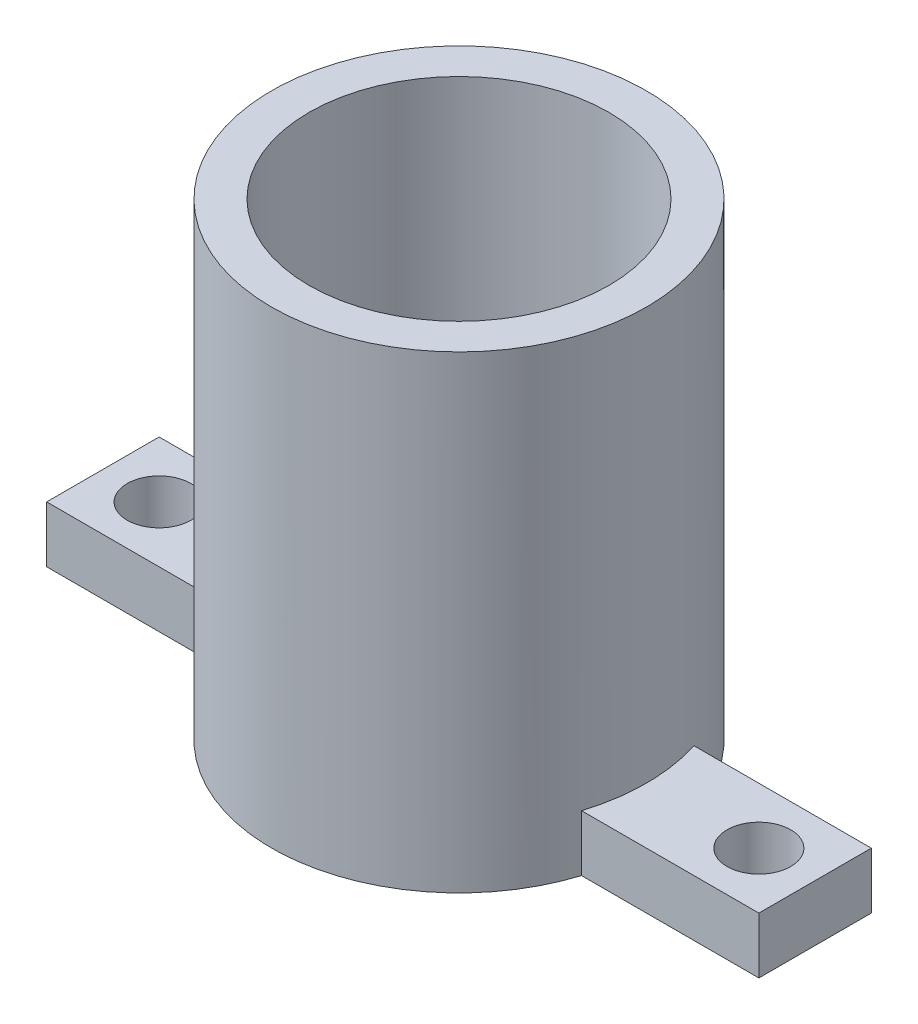
ISO-10303-21;
HEADER;
FILE_DESCRIPTION(('STEP AP214'),'2;1');
FILE_NAME('part.step','',(''),(''),'','','');
FILE_SCHEMA(('AUTOMOTIVE_DESIGN { 1 0 10303 214 1 1 1 1 }'));
ENDSEC;
DATA;
#1=APPLICATION_CONTEXT('core data for automotive mechanical design processes');
#2=APPLICATION_PROTOCOL_DEFINITION('international standard','automotive_design',2000,#1);
#3=PRODUCT_CONTEXT('',#1,'mechanical');
#4=PRODUCT('Part','Part','',(#3));
#5=PRODUCT_RELATED_PRODUCT_CATEGORY('part','',(#4));
#6=PRODUCT_DEFINITION_FORMATION('','',#4);
#7=PRODUCT_DEFINITION_CONTEXT('part definition',#1,'design');
#8=PRODUCT_DEFINITION('design','',#6,#7);
#9=PRODUCT_DEFINITION_SHAPE('','',#8);
#10=(LENGTH_UNIT() NAMED_UNIT(*) SI_UNIT(.MILLI.,.METRE.));
#11=(NAMED_UNIT(*) PLANE_ANGLE_UNIT() SI_UNIT($,.RADIAN.));
#12=(NAMED_UNIT(*) SI_UNIT($,.STERADIAN.) SOLID_ANGLE_UNIT());
#13=UNCERTAINTY_MEASURE_WITH_UNIT(LENGTH_MEASURE(1.E-05),#10,'distance_accuracy_value','');
#14=(GEOMETRIC_REPRESENTATION_CONTEXT(3) GLOBAL_UNCERTAINTY_ASSIGNED_CONTEXT((#13)) GLOBAL_UNIT_ASSIGNED_CONTEXT((#10,
#11,#12)) REPRESENTATION_CONTEXT('',''));
#15=CARTESIAN_POINT('',(0.,0.,0.));
#16=DIRECTION('',(0.,0.,1.));
#17=DIRECTION('',(1.,0.,0.));
#18=AXIS2_PLACEMENT_3D('',#15,#16,#17);
#19=CARTESIAN_POINT('',(0.,3.,0.));
#20=DIRECTION('',(0.,0.,-1.));
#21=DIRECTION('',(-1.,0.,0.));
#22=AXIS2_PLACEMENT_3D('',#19,#20,#21);
#23=PLANE('',#22);
#24=DIRECTION('',(1.,0.,0.));
#25=VECTOR('',#24,1.);
#26=CARTESIAN_POINT('',(0.,0.,0.));
#27=LINE('',#26,#25);
#28=CARTESIAN_POINT('',(28.5393920141695,0.,0.));
#29=VERTEX_POINT('',#28);
#30=CARTESIAN_POINT('',(38.,0.,0.));
#31=VERTEX_POINT('',#30);
#32=EDGE_CURVE('E164',#29,#31,#27,.T.);
#33=ORIENTED_EDGE('',*,*,#32,.T.);
#34=DIRECTION('',(0.,-1.,0.));
#35=VECTOR('',#34,1.);
#36=CARTESIAN_POINT('',(38.,3.,0.));
#37=LINE('',#36,#35);
#38=CARTESIAN_POINT('',(38.,3.,0.));
#39=VERTEX_POINT('',#38);
#40=EDGE_CURVE('E53',#39,#31,#37,.T.);
#41=ORIENTED_EDGE('',*,*,#40,.F.);
#42=DIRECTION('',(1.,0.,0.));
#43=VECTOR('',#42,1.);
#44=CARTESIAN_POINT('',(0.,3.,0.));
#45=LINE('',#44,#43);
#46=CARTESIAN_POINT('',(28.5393920141695,3.,0.));
#47=VERTEX_POINT('',#46);
#48=EDGE_CURVE('E174',#47,#39,#45,.T.);
#49=ORIENTED_EDGE('',*,*,#48,.F.);
#50=DIRECTION('',(0.,-1.,0.));
#51=VECTOR('',#50,1.);
#52=CARTESIAN_POINT('',(28.5393920141695,3.,0.));
#53=LINE('',#52,#51);
#54=EDGE_CURVE('E11',#47,#29,#53,.T.);
#55=ORIENTED_EDGE('',*,*,#54,.T.);
#56=EDGE_LOOP('',(#33,#41,#49,#55));
#57=FACE_BOUND('',#56,.T.);
#58=ADVANCED_FACE('F45',(#57),#23,.F.);
#59=CARTESIAN_POINT('',(38.,3.,0.));
#60=DIRECTION('',(-1.,0.,0.));
#61=DIRECTION('',(0.,0.,1.));
#62=AXIS2_PLACEMENT_3D('',#59,#60,#61);
#63=PLANE('',#62);
#64=DIRECTION('',(0.,0.,-1.));
#65=VECTOR('',#64,1.);
#66=CARTESIAN_POINT('',(38.,0.,0.));
#67=LINE('',#66,#65);
#68=CARTESIAN_POINT('',(38.,0.,-6.));
#69=VERTEX_POINT('',#68);
#70=EDGE_CURVE('E188',#31,#69,#67,.T.);
#71=ORIENTED_EDGE('',*,*,#70,.T.);
#72=DIRECTION('',(0.,-1.,0.));
#73=VECTOR('',#72,1.);
#74=CARTESIAN_POINT('',(38.,3.,-6.));
#75=LINE('',#74,#73);
#76=CARTESIAN_POINT('',(38.,3.,-6.));
#77=VERTEX_POINT('',#76);
#78=EDGE_CURVE('E198',#77,#69,#75,.T.);
#79=ORIENTED_EDGE('',*,*,#78,.F.);
#80=DIRECTION('',(0.,0.,-1.));
#81=VECTOR('',#80,1.);
#82=CARTESIAN_POINT('',(38.,3.,0.));
#83=LINE('',#82,#81);
#84=EDGE_CURVE('E178',#39,#77,#83,.T.);
#85=ORIENTED_EDGE('',*,*,#84,.F.);
#86=ORIENTED_EDGE('',*,*,#40,.T.);
#87=EDGE_LOOP('',(#71,#79,#85,#86));
#88=FACE_BOUND('',#87,.T.);
#89=ADVANCED_FACE('F206',(#88),#63,.F.);
#90=CARTESIAN_POINT('',(0.,3.,-6.));
#91=DIRECTION('',(0.,0.,-1.));
#92=DIRECTION('',(-1.,0.,0.));
#93=AXIS2_PLACEMENT_3D('',#90,#91,#92);
#94=PLANE('',#93);
#95=DIRECTION('',(1.,0.,0.));
#96=VECTOR('',#95,1.);
#97=CARTESIAN_POINT('',(0.,0.,-6.));
#98=LINE('',#97,#96);
#99=CARTESIAN_POINT('',(28.5393920141695,0.,-6.));
#100=VERTEX_POINT('',#99);
#101=EDGE_CURVE('E175',#100,#69,#98,.T.);
#102=ORIENTED_EDGE('',*,*,#101,.F.);
#103=DIRECTION('',(0.,-1.,0.));
#104=VECTOR('',#103,1.);
#105=CARTESIAN_POINT('',(28.5393920141695,3.,-6.));
#106=LINE('',#105,#104);
#107=CARTESIAN_POINT('',(28.5393920141695,3.,-6.));
#108=VERTEX_POINT('',#107);
#109=EDGE_CURVE('E185',#108,#100,#106,.T.);
#110=ORIENTED_EDGE('',*,*,#109,.F.);
#111=DIRECTION('',(1.,0.,0.));
#112=VECTOR('',#111,1.);
#113=CARTESIAN_POINT('',(0.,3.,-6.));
#114=LINE('',#113,#112);
#115=EDGE_CURVE('E181',#108,#77,#114,.T.);
#116=ORIENTED_EDGE('',*,*,#115,.T.);
#117=ORIENTED_EDGE('',*,*,#78,.T.);
#118=EDGE_LOOP('',(#102,#110,#116,#117));
#119=FACE_BOUND('',#118,.T.);
#120=ADVANCED_FACE('F217',(#119),#94,.T.);
#121=CARTESIAN_POINT('',(0.,3.,0.));
#122=DIRECTION('',(0.,1.,0.));
#123=DIRECTION('',(0.,0.,1.));
#124=AXIS2_PLACEMENT_3D('',#121,#122,#123);
#125=PLANE('',#124);
#126=CARTESIAN_POINT('',(35.,3.,-3.));
#127=DIRECTION('',(0.,1.,0.));
#128=DIRECTION('',(0.,0.,1.));
#129=AXIS2_PLACEMENT_3D('',#126,#127,#128);
#130=CIRCLE('',#129,1.69999999999999);
#131=CARTESIAN_POINT('',(35.,3.,-1.30000000000001));
#132=VERTEX_POINT('',#131);
#133=EDGE_CURVE('E333',#132,#132,#130,.T.);
#134=ORIENTED_EDGE('',*,*,#133,.F.);
#135=EDGE_LOOP('',(#134));
#136=FACE_BOUND('',#135,.T.);
#137=CARTESIAN_POINT('',(19.,3.,-3.));
#138=DIRECTION('',(0.,1.,0.));
#139=DIRECTION('',(0.,0.,1.));
#140=AXIS2_PLACEMENT_3D('',#137,#138,#139);
#141=CIRCLE('',#140,10.);
#142=EDGE_CURVE('E171',#47,#108,#141,.T.);
#143=ORIENTED_EDGE('',*,*,#142,.F.);
#144=ORIENTED_EDGE('',*,*,#48,.T.);
#145=ORIENTED_EDGE('',*,*,#84,.T.);
#146=ORIENTED_EDGE('',*,*,#115,.F.);
#147=EDGE_LOOP('',(#143,#144,#145,#146));
#148=FACE_BOUND('',#147,.T.);
#149=ADVANCED_FACE('F221',(#136,#148),#125,.T.);
#150=CARTESIAN_POINT('',(0.,0.,0.));
#151=DIRECTION('',(0.,1.,0.));
#152=DIRECTION('',(0.,0.,1.));
#153=AXIS2_PLACEMENT_3D('',#150,#151,#152);
#154=PLANE('',#153);
#155=CARTESIAN_POINT('',(3.,0.,-3.));
#156=DIRECTION('',(0.,1.,0.));
#157=DIRECTION('',(0.,0.,1.));
#158=AXIS2_PLACEMENT_3D('',#155,#156,#157);
#159=CIRCLE('',#158,1.7);
#160=CARTESIAN_POINT('',(3.,0.,-1.3));
#161=VERTEX_POINT('',#160);
#162=EDGE_CURVE('E326',#161,#161,#159,.T.);
#163=ORIENTED_EDGE('',*,*,#162,.T.);
#164=EDGE_LOOP('',(#163));
#165=FACE_BOUND('',#164,.T.);
#166=CARTESIAN_POINT('',(35.,0.,-3.));
#167=DIRECTION('',(0.,1.,0.));
#168=DIRECTION('',(0.,0.,1.));
#169=AXIS2_PLACEMENT_3D('',#166,#167,#168);
#170=CIRCLE('',#169,1.7);
#171=CARTESIAN_POINT('',(35.,0.,-1.3));
#172=VERTEX_POINT('',#171);
#173=EDGE_CURVE('E141',#172,#172,#170,.T.);
#174=ORIENTED_EDGE('',*,*,#173,.T.);
#175=EDGE_LOOP('',(#174));
#176=FACE_BOUND('',#175,.T.);
#177=ORIENTED_EDGE('',*,*,#32,.F.);
#178=CARTESIAN_POINT('',(19.,0.,-3.));
#179=DIRECTION('',(0.,1.,0.));
#180=DIRECTION('',(0.,0.,1.));
#181=AXIS2_PLACEMENT_3D('',#178,#179,#180);
#182=CIRCLE('',#181,10.);
#183=CARTESIAN_POINT('',(9.46060798583055,0.,0.));
#184=VERTEX_POINT('',#183);
#185=EDGE_CURVE('E168',#184,#29,#182,.T.);
#186=ORIENTED_EDGE('',*,*,#185,.F.);
#187=DIRECTION('',(1.,0.,0.));
#188=VECTOR('',#187,1.);
#189=CARTESIAN_POINT('',(0.,0.,0.));
#190=LINE('',#189,#188);
#191=CARTESIAN_POINT('',(0.,0.,0.));
#192=VERTEX_POINT('',#191);
#193=EDGE_CURVE('E144',#192,#184,#190,.T.);
#194=ORIENTED_EDGE('',*,*,#193,.F.);
#195=DIRECTION('',(0.,0.,-1.));
#196=VECTOR('',#195,1.);
#197=CARTESIAN_POINT('',(0.,0.,0.));
#198=LINE('',#197,#196);
#199=CARTESIAN_POINT('',(0.,0.,-6.));
#200=VERTEX_POINT('',#199);
#201=EDGE_CURVE('E140',#192,#200,#198,.T.);
#202=ORIENTED_EDGE('',*,*,#201,.T.);
#203=DIRECTION('',(1.,0.,0.));
#204=VECTOR('',#203,1.);
#205=CARTESIAN_POINT('',(0.,0.,-6.));
#206=LINE('',#205,#204);
#207=CARTESIAN_POINT('',(9.46060798583055,0.,-6.));
#208=VERTEX_POINT('',#207);
#209=EDGE_CURVE('E114',#200,#208,#206,.T.);
#210=ORIENTED_EDGE('',*,*,#209,.T.);
#211=EDGE_CURVE('E160',#100,#208,#182,.T.);
#212=ORIENTED_EDGE('',*,*,#211,.F.);
#213=ORIENTED_EDGE('',*,*,#101,.T.);
#214=ORIENTED_EDGE('',*,*,#70,.F.);
#215=EDGE_LOOP('',(#177,#186,#194,#202,#210,#212,#213,#214));
#216=FACE_BOUND('',#215,.T.);
#217=CARTESIAN_POINT('',(19.,0.,-3.));
#218=DIRECTION('',(0.,1.,0.));
#219=DIRECTION('',(0.,0.,1.));
#220=AXIS2_PLACEMENT_3D('',#217,#218,#219);
#221=CIRCLE('',#220,8.);
#222=CARTESIAN_POINT('',(19.,0.,5.));
#223=VERTEX_POINT('',#222);
#224=EDGE_CURVE('E154',#223,#223,#221,.T.);
#225=ORIENTED_EDGE('',*,*,#224,.T.);
#226=EDGE_LOOP('',(#225));
#227=FACE_BOUND('',#226,.T.);
#228=ADVANCED_FACE('F212',(#165,#176,#216,#227),#154,.F.);
#229=CARTESIAN_POINT('',(19.,25.,-3.));
#230=DIRECTION('',(0.,-1.,0.));
#231=DIRECTION('',(0.,0.,-1.));
#232=AXIS2_PLACEMENT_3D('',#229,#230,#231);
#233=CYLINDRICAL_SURFACE('',#232,10.);
#234=CARTESIAN_POINT('',(19.,25.,-3.));
#235=DIRECTION('',(0.,1.,0.));
#236=DIRECTION('',(0.,0.,1.));
#237=AXIS2_PLACEMENT_3D('',#234,#235,#236);
#238=CIRCLE('',#237,10.);
#239=CARTESIAN_POINT('',(19.,25.,7.));
#240=VERTEX_POINT('',#239);
#241=EDGE_CURVE('E159',#240,#240,#238,.T.);
#242=ORIENTED_EDGE('',*,*,#241,.F.);
#243=EDGE_LOOP('',(#242));
#244=FACE_BOUND('',#243,.T.);
#245=ORIENTED_EDGE('',*,*,#211,.T.);
#246=DIRECTION('',(0.,-1.,0.));
#247=VECTOR('',#246,1.);
#248=CARTESIAN_POINT('',(9.46060798583055,3.,-6.));
#249=LINE('',#248,#247);
#250=CARTESIAN_POINT('',(9.46060798583055,3.,-6.));
#251=VERTEX_POINT('',#250);
#252=EDGE_CURVE('E65',#251,#208,#249,.T.);
#253=ORIENTED_EDGE('',*,*,#252,.F.);
#254=CARTESIAN_POINT('',(19.,3.,-3.));
#255=DIRECTION('',(0.,1.,0.));
#256=DIRECTION('',(0.,0.,1.));
#257=AXIS2_PLACEMENT_3D('',#254,#255,#256);
#258=CIRCLE('',#257,10.);
#259=CARTESIAN_POINT('',(9.46060798583055,3.,0.));
#260=VERTEX_POINT('',#259);
#261=EDGE_CURVE('E60',#251,#260,#258,.T.);
#262=ORIENTED_EDGE('',*,*,#261,.T.);
#263=DIRECTION('',(0.,-1.,0.));
#264=VECTOR('',#263,1.);
#265=CARTESIAN_POINT('',(9.46060798583055,3.,0.));
#266=LINE('',#265,#264);
#267=EDGE_CURVE('E134',#260,#184,#266,.T.);
#268=ORIENTED_EDGE('',*,*,#267,.T.);
#269=ORIENTED_EDGE('',*,*,#185,.T.);
#270=ORIENTED_EDGE('',*,*,#54,.F.);
#271=ORIENTED_EDGE('',*,*,#142,.T.);
#272=ORIENTED_EDGE('',*,*,#109,.T.);
#273=EDGE_LOOP('',(#245,#253,#262,#268,#269,#270,#271,#272));
#274=FACE_BOUND('',#273,.T.);
#275=ADVANCED_FACE('F222',(#244,#274),#233,.T.);
#276=CARTESIAN_POINT('',(19.,25.,-3.));
#277=DIRECTION('',(0.,-1.,0.));
#278=DIRECTION('',(0.,0.,-1.));
#279=AXIS2_PLACEMENT_3D('',#276,#277,#278);
#280=CYLINDRICAL_SURFACE('',#279,8.);
#281=CARTESIAN_POINT('',(19.,25.,-3.));
#282=DIRECTION('',(0.,1.,0.));
#283=DIRECTION('',(0.,0.,1.));
#284=AXIS2_PLACEMENT_3D('',#281,#282,#283);
#285=CIRCLE('',#284,8.);
#286=CARTESIAN_POINT('',(19.,25.,5.));
#287=VERTEX_POINT('',#286);
#288=EDGE_CURVE('E155',#287,#287,#285,.T.);
#289=ORIENTED_EDGE('',*,*,#288,.T.);
#290=EDGE_LOOP('',(#289));
#291=FACE_BOUND('',#290,.T.);
#292=ORIENTED_EDGE('',*,*,#224,.F.);
#293=EDGE_LOOP('',(#292));
#294=FACE_BOUND('',#293,.T.);
#295=ADVANCED_FACE('F253',(#291,#294),#280,.F.);
#296=CARTESIAN_POINT('',(0.,25.,0.));
#297=DIRECTION('',(0.,1.,0.));
#298=DIRECTION('',(0.,0.,1.));
#299=AXIS2_PLACEMENT_3D('',#296,#297,#298);
#300=PLANE('',#299);
#301=ORIENTED_EDGE('',*,*,#288,.F.);
#302=EDGE_LOOP('',(#301));
#303=FACE_BOUND('',#302,.T.);
#304=ORIENTED_EDGE('',*,*,#241,.T.);
#305=EDGE_LOOP('',(#304));
#306=FACE_BOUND('',#305,.T.);
#307=ADVANCED_FACE('F256',(#303,#306),#300,.T.);
#308=CARTESIAN_POINT('',(0.,3.,-6.));
#309=DIRECTION('',(0.,0.,-1.));
#310=DIRECTION('',(-1.,0.,0.));
#311=AXIS2_PLACEMENT_3D('',#308,#309,#310);
#312=PLANE('',#311);
#313=ORIENTED_EDGE('',*,*,#209,.F.);
#314=DIRECTION('',(0.,-1.,0.));
#315=VECTOR('',#314,1.);
#316=CARTESIAN_POINT('',(0.,3.,-6.));
#317=LINE('',#316,#315);
#318=CARTESIAN_POINT('',(0.,3.,-6.));
#319=VERTEX_POINT('',#318);
#320=EDGE_CURVE('E109',#319,#200,#317,.T.);
#321=ORIENTED_EDGE('',*,*,#320,.F.);
#322=DIRECTION('',(1.,0.,0.));
#323=VECTOR('',#322,1.);
#324=CARTESIAN_POINT('',(0.,3.,-6.));
#325=LINE('',#324,#323);
#326=EDGE_CURVE('E112',#319,#251,#325,.T.);
#327=ORIENTED_EDGE('',*,*,#326,.T.);
#328=ORIENTED_EDGE('',*,*,#252,.T.);
#329=EDGE_LOOP('',(#313,#321,#327,#328));
#330=FACE_BOUND('',#329,.T.);
#331=ADVANCED_FACE('F111',(#330),#312,.T.);
#332=CARTESIAN_POINT('',(0.,3.,0.));
#333=DIRECTION('',(-1.,0.,0.));
#334=DIRECTION('',(0.,0.,1.));
#335=AXIS2_PLACEMENT_3D('',#332,#333,#334);
#336=PLANE('',#335);
#337=ORIENTED_EDGE('',*,*,#201,.F.);
#338=DIRECTION('',(0.,-1.,0.));
#339=VECTOR('',#338,1.);
#340=CARTESIAN_POINT('',(0.,3.,0.));
#341=LINE('',#340,#339);
#342=CARTESIAN_POINT('',(0.,3.,0.));
#343=VERTEX_POINT('',#342);
#344=EDGE_CURVE('E120',#343,#192,#341,.T.);
#345=ORIENTED_EDGE('',*,*,#344,.F.);
#346=DIRECTION('',(0.,0.,-1.));
#347=VECTOR('',#346,1.);
#348=CARTESIAN_POINT('',(0.,3.,0.));
#349=LINE('',#348,#347);
#350=EDGE_CURVE('E125',#343,#319,#349,.T.);
#351=ORIENTED_EDGE('',*,*,#350,.T.);
#352=ORIENTED_EDGE('',*,*,#320,.T.);
#353=EDGE_LOOP('',(#337,#345,#351,#352));
#354=FACE_BOUND('',#353,.T.);
#355=ADVANCED_FACE('F128',(#354),#336,.T.);
#356=CARTESIAN_POINT('',(0.,3.,0.));
#357=DIRECTION('',(0.,0.,-1.));
#358=DIRECTION('',(-1.,0.,0.));
#359=AXIS2_PLACEMENT_3D('',#356,#357,#358);
#360=PLANE('',#359);
#361=ORIENTED_EDGE('',*,*,#193,.T.);
#362=ORIENTED_EDGE('',*,*,#267,.F.);
#363=DIRECTION('',(1.,0.,0.));
#364=VECTOR('',#363,1.);
#365=CARTESIAN_POINT('',(0.,3.,0.));
#366=LINE('',#365,#364);
#367=EDGE_CURVE('E131',#343,#260,#366,.T.);
#368=ORIENTED_EDGE('',*,*,#367,.F.);
#369=ORIENTED_EDGE('',*,*,#344,.T.);
#370=EDGE_LOOP('',(#361,#362,#368,#369));
#371=FACE_BOUND('',#370,.T.);
#372=ADVANCED_FACE('F227',(#371),#360,.F.);
#373=CARTESIAN_POINT('',(0.,3.,0.));
#374=DIRECTION('',(0.,1.,0.));
#375=DIRECTION('',(0.,0.,1.));
#376=AXIS2_PLACEMENT_3D('',#373,#374,#375);
#377=PLANE('',#376);
#378=CARTESIAN_POINT('',(3.,3.,-3.));
#379=DIRECTION('',(0.,1.,0.));
#380=DIRECTION('',(0.,0.,1.));
#381=AXIS2_PLACEMENT_3D('',#378,#379,#380);
#382=CIRCLE('',#381,1.69999999999999);
#383=CARTESIAN_POINT('',(3.,3.,-1.30000000000001));
#384=VERTEX_POINT('',#383);
#385=EDGE_CURVE('E329',#384,#384,#382,.T.);
#386=ORIENTED_EDGE('',*,*,#385,.F.);
#387=EDGE_LOOP('',(#386));
#388=FACE_BOUND('',#387,.T.);
#389=ORIENTED_EDGE('',*,*,#261,.F.);
#390=ORIENTED_EDGE('',*,*,#326,.F.);
#391=ORIENTED_EDGE('',*,*,#350,.F.);
#392=ORIENTED_EDGE('',*,*,#367,.T.);
#393=EDGE_LOOP('',(#389,#390,#391,#392));
#394=FACE_BOUND('',#393,.T.);
#395=ADVANCED_FACE('F124',(#388,#394),#377,.T.);
#396=CARTESIAN_POINT('',(35.,3.,-3.));
#397=DIRECTION('',(0.,1.,0.));
#398=DIRECTION('',(0.,0.,1.));
#399=AXIS2_PLACEMENT_3D('',#396,#397,#398);
#400=CYLINDRICAL_SURFACE('',#399,1.69999999999999);
#401=ORIENTED_EDGE('',*,*,#173,.F.);
#402=EDGE_LOOP('',(#401));
#403=FACE_BOUND('',#402,.T.);
#404=ORIENTED_EDGE('',*,*,#133,.T.);
#405=EDGE_LOOP('',(#404));
#406=FACE_BOUND('',#405,.T.);
#407=ADVANCED_FACE('F235',(#403,#406),#400,.F.);
#408=CARTESIAN_POINT('',(3.,3.,-3.));
#409=DIRECTION('',(0.,1.,0.));
#410=DIRECTION('',(0.,0.,1.));
#411=AXIS2_PLACEMENT_3D('',#408,#409,#410);
#412=CYLINDRICAL_SURFACE('',#411,1.69999999999999);
#413=ORIENTED_EDGE('',*,*,#162,.F.);
#414=EDGE_LOOP('',(#413));
#415=FACE_BOUND('',#414,.T.);
#416=ORIENTED_EDGE('',*,*,#385,.T.);
#417=EDGE_LOOP('',(#416));
#418=FACE_BOUND('',#417,.T.);
#419=ADVANCED_FACE('F309',(#415,#418),#412,.F.);
#420=CLOSED_SHELL('',(#58,#89,#120,#149,#228,#275,#295,#307,#331,#355,#372,#395,#407,#419));
#421=MANIFOLD_SOLID_BREP('B2',#420);
#422=ADVANCED_BREP_SHAPE_REPRESENTATION('',(#18,#421),#14);
#423=SHAPE_DEFINITION_REPRESENTATION(#9,#422);
ENDSEC;
END-ISO-10303-21;
